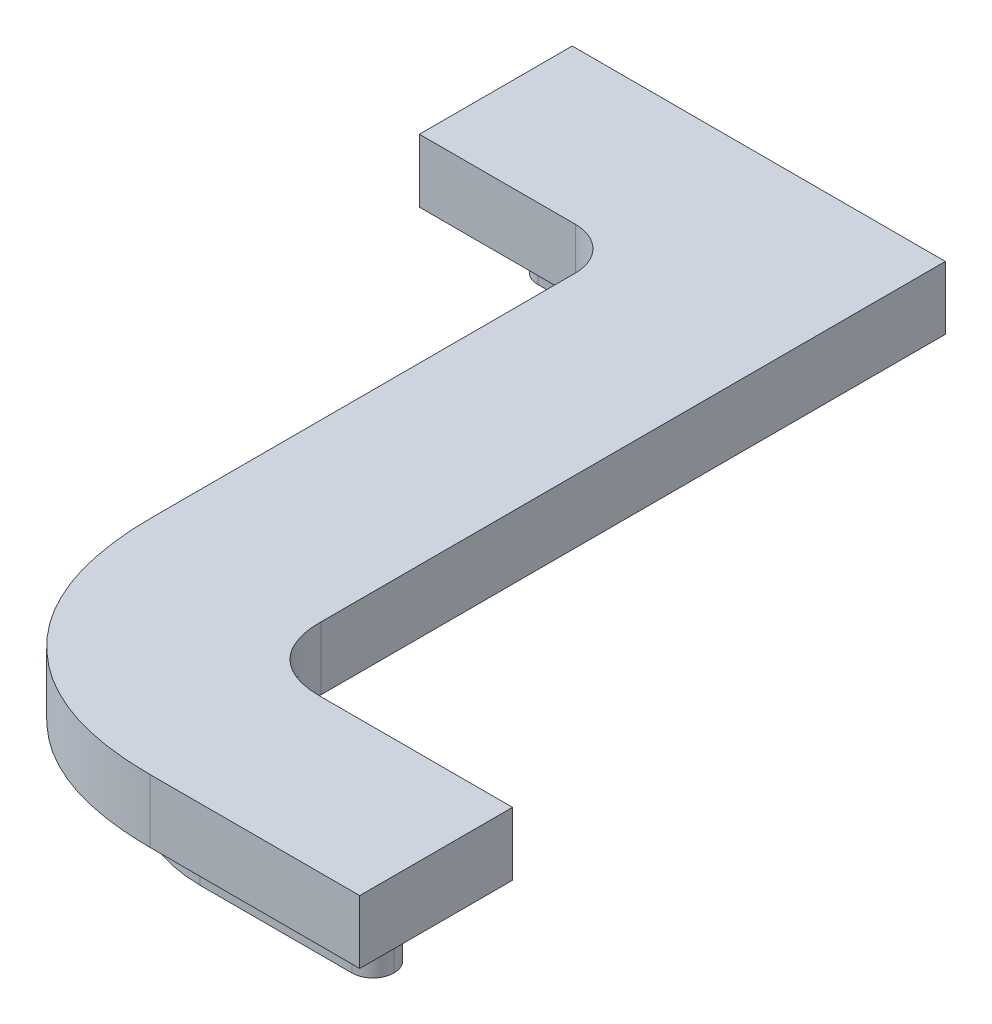
ISO-10303-21;
HEADER;
FILE_DESCRIPTION(('STEP AP214'),'2;1');
FILE_NAME('part.step','',(''),(''),'','','');
FILE_SCHEMA(('AUTOMOTIVE_DESIGN { 1 0 10303 214 1 1 1 1 }'));
ENDSEC;
DATA;
#1=APPLICATION_CONTEXT('core data for automotive mechanical design processes');
#2=APPLICATION_PROTOCOL_DEFINITION('international standard','automotive_design',2000,#1);
#3=PRODUCT_CONTEXT('',#1,'mechanical');
#4=PRODUCT('Part','Part','',(#3));
#5=PRODUCT_RELATED_PRODUCT_CATEGORY('part','',(#4));
#6=PRODUCT_DEFINITION_FORMATION('','',#4);
#7=PRODUCT_DEFINITION_CONTEXT('part definition',#1,'design');
#8=PRODUCT_DEFINITION('design','',#6,#7);
#9=PRODUCT_DEFINITION_SHAPE('','',#8);
#10=(LENGTH_UNIT() NAMED_UNIT(*) SI_UNIT(.MILLI.,.METRE.));
#11=(NAMED_UNIT(*) PLANE_ANGLE_UNIT() SI_UNIT($,.RADIAN.));
#12=(NAMED_UNIT(*) SI_UNIT($,.STERADIAN.) SOLID_ANGLE_UNIT());
#13=UNCERTAINTY_MEASURE_WITH_UNIT(LENGTH_MEASURE(1.E-05),#10,'distance_accuracy_value','');
#14=(GEOMETRIC_REPRESENTATION_CONTEXT(3) GLOBAL_UNCERTAINTY_ASSIGNED_CONTEXT((#13)) GLOBAL_UNIT_ASSIGNED_CONTEXT((#10,
#11,#12)) REPRESENTATION_CONTEXT('',''));
#15=CARTESIAN_POINT('',(0.,0.,0.));
#16=DIRECTION('',(0.,0.,1.));
#17=DIRECTION('',(1.,0.,0.));
#18=AXIS2_PLACEMENT_3D('',#15,#16,#17);
#19=CARTESIAN_POINT('',(37.0764102564102,15.,-163.701923076923));
#20=DIRECTION('',(0.,0.,-1.));
#21=DIRECTION('',(-1.,0.,0.));
#22=AXIS2_PLACEMENT_3D('',#19,#20,#21);
#23=PLANE('',#22);
#24=DIRECTION('',(1.,0.,0.));
#25=VECTOR('',#24,1.);
#26=CARTESIAN_POINT('',(37.0764102564102,0.,-163.701923076923));
#27=LINE('',#26,#25);
#28=CARTESIAN_POINT('',(0.,0.,-163.701923076923));
#29=VERTEX_POINT('',#28);
#30=CARTESIAN_POINT('',(37.0764102564102,0.,-163.701923076923));
#31=VERTEX_POINT('',#30);
#32=EDGE_CURVE('E278',#29,#31,#27,.T.);
#33=ORIENTED_EDGE('',*,*,#32,.T.);
#34=DIRECTION('',(0.,-1.,0.));
#35=VECTOR('',#34,1.);
#36=CARTESIAN_POINT('',(37.0764102564102,15.,-163.701923076923));
#37=LINE('',#36,#35);
#38=CARTESIAN_POINT('',(37.0764102564102,15.,-163.701923076923));
#39=VERTEX_POINT('',#38);
#40=EDGE_CURVE('E550',#39,#31,#37,.T.);
#41=ORIENTED_EDGE('',*,*,#40,.F.);
#42=DIRECTION('',(1.,0.,0.));
#43=VECTOR('',#42,1.);
#44=CARTESIAN_POINT('',(37.0764102564102,15.,-163.701923076923));
#45=LINE('',#44,#43);
#46=CARTESIAN_POINT('',(0.,15.,-163.701923076923));
#47=VERTEX_POINT('',#46);
#48=EDGE_CURVE('E293',#47,#39,#45,.T.);
#49=ORIENTED_EDGE('',*,*,#48,.F.);
#50=DIRECTION('',(0.,-1.,0.));
#51=VECTOR('',#50,1.);
#52=CARTESIAN_POINT('',(0.,15.,-163.701923076923));
#53=LINE('',#52,#51);
#54=EDGE_CURVE('E489',#47,#29,#53,.T.);
#55=ORIENTED_EDGE('',*,*,#54,.T.);
#56=EDGE_LOOP('',(#33,#41,#49,#55));
#57=FACE_BOUND('',#56,.T.);
#58=ADVANCED_FACE('F38',(#57),#23,.F.);
#59=CARTESIAN_POINT('',(37.0764102564103,15.,-153.701923076923));
#60=DIRECTION('',(0.,-1.,0.));
#61=DIRECTION('',(0.,0.,-1.));
#62=AXIS2_PLACEMENT_3D('',#59,#60,#61);
#63=CYLINDRICAL_SURFACE('',#62,10.);
#64=CARTESIAN_POINT('',(37.0764102564103,0.,-153.701923076923));
#65=DIRECTION('',(0.,-1.,0.));
#66=DIRECTION('',(0.,0.,1.));
#67=AXIS2_PLACEMENT_3D('',#64,#65,#66);
#68=CIRCLE('',#67,10.);
#69=CARTESIAN_POINT('',(47.0764102564103,0.,-153.701923076923));
#70=VERTEX_POINT('',#69);
#71=EDGE_CURVE('E492',#31,#70,#68,.T.);
#72=ORIENTED_EDGE('',*,*,#71,.T.);
#73=DIRECTION('',(0.,-1.,0.));
#74=VECTOR('',#73,1.);
#75=CARTESIAN_POINT('',(47.0764102564103,15.,-153.701923076923));
#76=LINE('',#75,#74);
#77=CARTESIAN_POINT('',(47.0764102564103,15.,-153.701923076923));
#78=VERTEX_POINT('',#77);
#79=EDGE_CURVE('E547',#78,#70,#76,.T.);
#80=ORIENTED_EDGE('',*,*,#79,.F.);
#81=CARTESIAN_POINT('',(37.0764102564103,15.,-153.701923076923));
#82=DIRECTION('',(0.,-1.,0.));
#83=DIRECTION('',(0.,0.,1.));
#84=AXIS2_PLACEMENT_3D('',#81,#82,#83);
#85=CIRCLE('',#84,10.);
#86=EDGE_CURVE('E296',#39,#78,#85,.T.);
#87=ORIENTED_EDGE('',*,*,#86,.F.);
#88=ORIENTED_EDGE('',*,*,#40,.T.);
#89=EDGE_LOOP('',(#72,#80,#87,#88));
#90=FACE_BOUND('',#89,.T.);
#91=ADVANCED_FACE('F322',(#90),#63,.F.);
#92=CARTESIAN_POINT('',(47.0764102564103,15.,-53.1650641025641));
#93=DIRECTION('',(1.,0.,0.));
#94=DIRECTION('',(0.,0.,-1.));
#95=AXIS2_PLACEMENT_3D('',#92,#93,#94);
#96=PLANE('',#95);
#97=DIRECTION('',(0.,0.,1.));
#98=VECTOR('',#97,1.);
#99=CARTESIAN_POINT('',(47.0764102564103,0.,-53.1650641025641));
#100=LINE('',#99,#98);
#101=CARTESIAN_POINT('',(47.0764102564103,0.,-53.1650641025641));
#102=VERTEX_POINT('',#101);
#103=EDGE_CURVE('E494',#70,#102,#100,.T.);
#104=ORIENTED_EDGE('',*,*,#103,.T.);
#105=DIRECTION('',(0.,-1.,0.));
#106=VECTOR('',#105,1.);
#107=CARTESIAN_POINT('',(47.0764102564103,15.,-53.1650641025641));
#108=LINE('',#107,#106);
#109=CARTESIAN_POINT('',(47.0764102564103,15.,-53.1650641025641));
#110=VERTEX_POINT('',#109);
#111=EDGE_CURVE('E544',#110,#102,#108,.T.);
#112=ORIENTED_EDGE('',*,*,#111,.F.);
#113=DIRECTION('',(0.,0.,1.));
#114=VECTOR('',#113,1.);
#115=CARTESIAN_POINT('',(47.0764102564103,15.,-53.1650641025641));
#116=LINE('',#115,#114);
#117=EDGE_CURVE('E299',#78,#110,#116,.T.);
#118=ORIENTED_EDGE('',*,*,#117,.F.);
#119=ORIENTED_EDGE('',*,*,#79,.T.);
#120=EDGE_LOOP('',(#104,#112,#118,#119));
#121=FACE_BOUND('',#120,.T.);
#122=ADVANCED_FACE('F317',(#121),#96,.F.);
#123=CARTESIAN_POINT('',(47.0764102564103,15.,-53.1650641025641));
#124=CARTESIAN_POINT('',(47.0223914539136,15.,-49.2205914346598));
#125=CARTESIAN_POINT('',(47.490582866725,15.,-43.4418682344713));
#126=CARTESIAN_POINT('',(48.9340020285453,15.,-36.0357843236271));
#127=CARTESIAN_POINT('',(50.4537891082744,15.,-30.9580072773758));
#128=CARTESIAN_POINT('',(52.441129709461,15.,-26.2248686930387));
#129=CARTESIAN_POINT('',(54.8335542346932,15.,-21.8052640760056));
#130=CARTESIAN_POINT('',(57.6963001509259,15.,-17.7306783300494));
#131=CARTESIAN_POINT('',(60.9888602548678,15.,-14.0464264073738));
#132=CARTESIAN_POINT('',(64.6570791168126,15.,-10.7440013801647));
#133=CARTESIAN_POINT('',(68.659607959632,15.,-7.84267512579838));
#134=CARTESIAN_POINT('',(73.0474211778718,15.,-5.43577363491742));
#135=CARTESIAN_POINT('',(77.7224103867646,15.,-3.42066978882483));
#136=CARTESIAN_POINT('',(82.7564497572889,15.,-1.91342324769866));
#137=CARTESIAN_POINT('',(90.049186966096,15.,-0.354248464101049));
#138=CARTESIAN_POINT('',(95.787985552182,15.,-0.0565611925962197));
#139=CARTESIAN_POINT('',(99.6805769230769,15.,0.));
#140=B_SPLINE_CURVE_WITH_KNOTS('',3,(#123,#124,#125,#126,#127,#128,#129,#130,#131,#132,#133,
#134,#135,#136,#137,#138,#139),.UNSPECIFIED.,.F.,.F.,(4,1,1,1,1,1,1,1,1,1,1,1,1,1,4),(0.,
0.139367673018385,0.204389389727037,0.266545229328978,0.326453394085407,0.385631058355293,
0.443939169385015,0.502143900552233,0.559996915054743,0.618193981149015,0.676544157389738,
0.736636343687914,0.79788844457623,0.862079824017859,1.),.UNSPECIFIED.);
#141=DIRECTION('',(0.,-1.,0.));
#142=VECTOR('',#141,1.);
#143=SURFACE_OF_LINEAR_EXTRUSION('',#140,#142);
#144=CARTESIAN_POINT('',(47.0764102564103,0.,-53.1650641025641));
#145=CARTESIAN_POINT('',(47.0223914539136,0.,-49.2205914346598));
#146=CARTESIAN_POINT('',(47.490582866725,0.,-43.4418682344713));
#147=CARTESIAN_POINT('',(48.9340020285453,0.,-36.0357843236271));
#148=CARTESIAN_POINT('',(50.4537891082744,0.,-30.9580072773758));
#149=CARTESIAN_POINT('',(52.441129709461,0.,-26.2248686930387));
#150=CARTESIAN_POINT('',(54.8335542346932,0.,-21.8052640760056));
#151=CARTESIAN_POINT('',(57.6963001509259,0.,-17.7306783300494));
#152=CARTESIAN_POINT('',(60.9888602548678,0.,-14.0464264073738));
#153=CARTESIAN_POINT('',(64.6570791168126,0.,-10.7440013801647));
#154=CARTESIAN_POINT('',(68.659607959632,0.,-7.84267512579838));
#155=CARTESIAN_POINT('',(73.0474211778718,0.,-5.43577363491742));
#156=CARTESIAN_POINT('',(77.7224103867646,0.,-3.42066978882483));
#157=CARTESIAN_POINT('',(82.7564497572889,0.,-1.91342324769866));
#158=CARTESIAN_POINT('',(90.049186966096,0.,-0.354248464101049));
#159=CARTESIAN_POINT('',(95.787985552182,0.,-0.0565611925962197));
#160=CARTESIAN_POINT('',(99.6805769230769,0.,0.));
#161=B_SPLINE_CURVE_WITH_KNOTS('',3,(#144,#145,#146,#147,#148,#149,#150,#151,#152,#153,#154,
#155,#156,#157,#158,#159,#160),.UNSPECIFIED.,.F.,.F.,(4,1,1,1,1,1,1,1,1,1,1,1,1,1,4),(0.,
0.139367673018385,0.204389389727037,0.266545229328978,0.326453394085407,0.385631058355293,
0.443939169385015,0.502143900552233,0.559996915054743,0.618193981149015,0.676544157389738,
0.736636343687914,0.79788844457623,0.862079824017859,1.),.UNSPECIFIED.);
#162=CARTESIAN_POINT('',(99.6805769230769,0.,0.));
#163=VERTEX_POINT('',#162);
#164=EDGE_CURVE('E496',#102,#163,#161,.T.);
#165=ORIENTED_EDGE('',*,*,#164,.T.);
#166=DIRECTION('',(0.,-1.,0.));
#167=VECTOR('',#166,1.);
#168=CARTESIAN_POINT('',(99.6805769230769,15.,0.));
#169=LINE('',#168,#167);
#170=CARTESIAN_POINT('',(99.6805769230769,15.,0.));
#171=VERTEX_POINT('',#170);
#172=EDGE_CURVE('E541',#171,#163,#169,.T.);
#173=ORIENTED_EDGE('',*,*,#172,.F.);
#174=EDGE_CURVE('E301',#110,#171,#140,.T.);
#175=ORIENTED_EDGE('',*,*,#174,.F.);
#176=ORIENTED_EDGE('',*,*,#111,.T.);
#177=EDGE_LOOP('',(#165,#173,#175,#176));
#178=FACE_BOUND('',#177,.T.);
#179=ADVANCED_FACE('F312',(#178),#143,.F.);
#180=CARTESIAN_POINT('',(149.520320512821,15.,0.));
#181=DIRECTION('',(0.,0.,-1.));
#182=DIRECTION('',(-1.,0.,0.));
#183=AXIS2_PLACEMENT_3D('',#180,#181,#182);
#184=PLANE('',#183);
#185=DIRECTION('',(1.,0.,0.));
#186=VECTOR('',#185,1.);
#187=CARTESIAN_POINT('',(149.520320512821,0.,0.));
#188=LINE('',#187,#186);
#189=CARTESIAN_POINT('',(149.520320512821,0.,0.));
#190=VERTEX_POINT('',#189);
#191=EDGE_CURVE('E500',#163,#190,#188,.T.);
#192=ORIENTED_EDGE('',*,*,#191,.T.);
#193=DIRECTION('',(0.,-1.,0.));
#194=VECTOR('',#193,1.);
#195=CARTESIAN_POINT('',(149.520320512821,15.,0.));
#196=LINE('',#195,#194);
#197=CARTESIAN_POINT('',(149.520320512821,15.,0.));
#198=VERTEX_POINT('',#197);
#199=EDGE_CURVE('E538',#198,#190,#196,.T.);
#200=ORIENTED_EDGE('',*,*,#199,.F.);
#201=DIRECTION('',(1.,0.,0.));
#202=VECTOR('',#201,1.);
#203=CARTESIAN_POINT('',(149.520320512821,15.,0.));
#204=LINE('',#203,#202);
#205=EDGE_CURVE('E306',#171,#198,#204,.T.);
#206=ORIENTED_EDGE('',*,*,#205,.F.);
#207=ORIENTED_EDGE('',*,*,#172,.T.);
#208=EDGE_LOOP('',(#192,#200,#206,#207));
#209=FACE_BOUND('',#208,.T.);
#210=ADVANCED_FACE('F316',(#209),#184,.F.);
#211=CARTESIAN_POINT('',(149.520320512821,15.,-36.2980769230769));
#212=DIRECTION('',(-1.,0.,0.));
#213=DIRECTION('',(0.,0.,1.));
#214=AXIS2_PLACEMENT_3D('',#211,#212,#213);
#215=PLANE('',#214);
#216=DIRECTION('',(0.,0.,-1.));
#217=VECTOR('',#216,1.);
#218=CARTESIAN_POINT('',(149.520320512821,0.,-36.2980769230769));
#219=LINE('',#218,#217);
#220=CARTESIAN_POINT('',(149.520320512821,0.,-36.2980769230769));
#221=VERTEX_POINT('',#220);
#222=EDGE_CURVE('E505',#190,#221,#219,.T.);
#223=ORIENTED_EDGE('',*,*,#222,.T.);
#224=DIRECTION('',(0.,-1.,0.));
#225=VECTOR('',#224,1.);
#226=CARTESIAN_POINT('',(149.520320512821,15.,-36.2980769230769));
#227=LINE('',#226,#225);
#228=CARTESIAN_POINT('',(149.520320512821,15.,-36.2980769230769));
#229=VERTEX_POINT('',#228);
#230=EDGE_CURVE('E535',#229,#221,#227,.T.);
#231=ORIENTED_EDGE('',*,*,#230,.F.);
#232=DIRECTION('',(0.,0.,-1.));
#233=VECTOR('',#232,1.);
#234=CARTESIAN_POINT('',(149.520320512821,15.,-36.2980769230769));
#235=LINE('',#234,#233);
#236=EDGE_CURVE('E605',#198,#229,#235,.T.);
#237=ORIENTED_EDGE('',*,*,#236,.F.);
#238=ORIENTED_EDGE('',*,*,#199,.T.);
#239=EDGE_LOOP('',(#223,#231,#237,#238));
#240=FACE_BOUND('',#239,.T.);
#241=ADVANCED_FACE('F603',(#240),#215,.F.);
#242=CARTESIAN_POINT('',(103.847243589744,15.,-36.2980769230769));
#243=DIRECTION('',(0.,0.,1.));
#244=DIRECTION('',(1.,0.,0.));
#245=AXIS2_PLACEMENT_3D('',#242,#243,#244);
#246=PLANE('',#245);
#247=DIRECTION('',(-1.,0.,0.));
#248=VECTOR('',#247,1.);
#249=CARTESIAN_POINT('',(103.847243589744,0.,-36.2980769230769));
#250=LINE('',#249,#248);
#251=CARTESIAN_POINT('',(103.847243589744,0.,-36.2980769230769));
#252=VERTEX_POINT('',#251);
#253=EDGE_CURVE('E507',#221,#252,#250,.T.);
#254=ORIENTED_EDGE('',*,*,#253,.T.);
#255=DIRECTION('',(0.,-1.,0.));
#256=VECTOR('',#255,1.);
#257=CARTESIAN_POINT('',(103.847243589744,15.,-36.2980769230769));
#258=LINE('',#257,#256);
#259=CARTESIAN_POINT('',(103.847243589744,15.,-36.2980769230769));
#260=VERTEX_POINT('',#259);
#261=EDGE_CURVE('E532',#260,#252,#258,.T.);
#262=ORIENTED_EDGE('',*,*,#261,.F.);
#263=DIRECTION('',(-1.,0.,0.));
#264=VECTOR('',#263,1.);
#265=CARTESIAN_POINT('',(103.847243589744,15.,-36.2980769230769));
#266=LINE('',#265,#264);
#267=EDGE_CURVE('E480',#229,#260,#266,.T.);
#268=ORIENTED_EDGE('',*,*,#267,.F.);
#269=ORIENTED_EDGE('',*,*,#230,.T.);
#270=EDGE_LOOP('',(#254,#262,#268,#269));
#271=FACE_BOUND('',#270,.T.);
#272=ADVANCED_FACE('F471',(#271),#246,.F.);
#273=CARTESIAN_POINT('',(103.847243589744,15.,-36.2980769230769));
#274=CARTESIAN_POINT('',(101.687793553922,15.,-36.2886461989768));
#275=CARTESIAN_POINT('',(98.4929336917402,15.,-36.6691906997311));
#276=CARTESIAN_POINT('',(94.8002932546507,15.,-38.4798858647078));
#277=CARTESIAN_POINT('',(92.5436805057884,15.,-40.2729447282628));
#278=CARTESIAN_POINT('',(90.7560665444635,15.,-42.5488365957673));
#279=CARTESIAN_POINT('',(89.0340953603292,15.,-46.3140425211422));
#280=CARTESIAN_POINT('',(88.5843241362368,15.,-49.498745128976));
#281=CARTESIAN_POINT('',(88.6228846153846,15.,-51.6826923076923));
#282=B_SPLINE_CURVE_WITH_KNOTS('',3,(#273,#274,#275,#276,#277,#278,#279,#280,#281),
.UNSPECIFIED.,.F.,.F.,(4,1,1,1,1,1,4),(0.,0.265143967513863,0.383298646538262,0.498166168431169,
0.614311634426918,0.733229188654396,1.),.UNSPECIFIED.);
#283=DIRECTION('',(0.,-1.,0.));
#284=VECTOR('',#283,1.);
#285=SURFACE_OF_LINEAR_EXTRUSION('',#282,#284);
#286=CARTESIAN_POINT('',(103.847243589744,0.,-36.2980769230769));
#287=CARTESIAN_POINT('',(101.687793553922,0.,-36.2886461989768));
#288=CARTESIAN_POINT('',(98.4929336917402,0.,-36.6691906997311));
#289=CARTESIAN_POINT('',(94.8002932546507,0.,-38.4798858647078));
#290=CARTESIAN_POINT('',(92.5436805057884,0.,-40.2729447282628));
#291=CARTESIAN_POINT('',(90.7560665444635,0.,-42.5488365957673));
#292=CARTESIAN_POINT('',(89.0340953603292,0.,-46.3140425211422));
#293=CARTESIAN_POINT('',(88.5843241362368,0.,-49.498745128976));
#294=CARTESIAN_POINT('',(88.6228846153846,0.,-51.6826923076923));
#295=B_SPLINE_CURVE_WITH_KNOTS('',3,(#286,#287,#288,#289,#290,#291,#292,#293,#294),
.UNSPECIFIED.,.F.,.F.,(4,1,1,1,1,1,4),(0.,0.265143967513863,0.383298646538262,0.498166168431169,
0.614311634426918,0.733229188654396,1.),.UNSPECIFIED.);
#296=CARTESIAN_POINT('',(88.6228846153846,0.,-51.6826923076923));
#297=VERTEX_POINT('',#296);
#298=EDGE_CURVE('E509',#252,#297,#295,.T.);
#299=ORIENTED_EDGE('',*,*,#298,.T.);
#300=DIRECTION('',(0.,-1.,0.));
#301=VECTOR('',#300,1.);
#302=CARTESIAN_POINT('',(88.6228846153846,15.,-51.6826923076923));
#303=LINE('',#302,#301);
#304=CARTESIAN_POINT('',(88.6228846153846,15.,-51.6826923076923));
#305=VERTEX_POINT('',#304);
#306=EDGE_CURVE('E529',#305,#297,#303,.T.);
#307=ORIENTED_EDGE('',*,*,#306,.F.);
#308=EDGE_CURVE('E473',#260,#305,#282,.T.);
#309=ORIENTED_EDGE('',*,*,#308,.F.);
#310=ORIENTED_EDGE('',*,*,#261,.T.);
#311=EDGE_LOOP('',(#299,#307,#309,#310));
#312=FACE_BOUND('',#311,.T.);
#313=ADVANCED_FACE('F466',(#312),#285,.F.);
#314=CARTESIAN_POINT('',(88.6228846153846,15.,-200.));
#315=DIRECTION('',(-1.,0.,0.));
#316=DIRECTION('',(0.,0.,1.));
#317=AXIS2_PLACEMENT_3D('',#314,#315,#316);
#318=PLANE('',#317);
#319=DIRECTION('',(0.,0.,-1.));
#320=VECTOR('',#319,1.);
#321=CARTESIAN_POINT('',(88.6228846153846,0.,-200.));
#322=LINE('',#321,#320);
#323=CARTESIAN_POINT('',(88.6228846153846,0.,-200.));
#324=VERTEX_POINT('',#323);
#325=EDGE_CURVE('E513',#297,#324,#322,.T.);
#326=ORIENTED_EDGE('',*,*,#325,.T.);
#327=DIRECTION('',(0.,-1.,0.));
#328=VECTOR('',#327,1.);
#329=CARTESIAN_POINT('',(88.6228846153846,15.,-200.));
#330=LINE('',#329,#328);
#331=CARTESIAN_POINT('',(88.6228846153846,15.,-200.));
#332=VERTEX_POINT('',#331);
#333=EDGE_CURVE('E526',#332,#324,#330,.T.);
#334=ORIENTED_EDGE('',*,*,#333,.F.);
#335=DIRECTION('',(0.,0.,-1.));
#336=VECTOR('',#335,1.);
#337=CARTESIAN_POINT('',(88.6228846153846,15.,-200.));
#338=LINE('',#337,#336);
#339=EDGE_CURVE('E479',#305,#332,#338,.T.);
#340=ORIENTED_EDGE('',*,*,#339,.F.);
#341=ORIENTED_EDGE('',*,*,#306,.T.);
#342=EDGE_LOOP('',(#326,#334,#340,#341));
#343=FACE_BOUND('',#342,.T.);
#344=ADVANCED_FACE('F462',(#343),#318,.F.);
#345=CARTESIAN_POINT('',(0.,15.,-200.));
#346=DIRECTION('',(0.,0.,1.));
#347=DIRECTION('',(1.,0.,0.));
#348=AXIS2_PLACEMENT_3D('',#345,#346,#347);
#349=PLANE('',#348);
#350=DIRECTION('',(-1.,0.,0.));
#351=VECTOR('',#350,1.);
#352=CARTESIAN_POINT('',(0.,0.,-200.));
#353=LINE('',#352,#351);
#354=CARTESIAN_POINT('',(0.,0.,-200.));
#355=VERTEX_POINT('',#354);
#356=EDGE_CURVE('E518',#324,#355,#353,.T.);
#357=ORIENTED_EDGE('',*,*,#356,.T.);
#358=DIRECTION('',(0.,-1.,0.));
#359=VECTOR('',#358,1.);
#360=CARTESIAN_POINT('',(0.,15.,-200.));
#361=LINE('',#360,#359);
#362=CARTESIAN_POINT('',(0.,15.,-200.));
#363=VERTEX_POINT('',#362);
#364=EDGE_CURVE('E523',#363,#355,#361,.T.);
#365=ORIENTED_EDGE('',*,*,#364,.F.);
#366=DIRECTION('',(-1.,0.,0.));
#367=VECTOR('',#366,1.);
#368=CARTESIAN_POINT('',(0.,15.,-200.));
#369=LINE('',#368,#367);
#370=EDGE_CURVE('E485',#332,#363,#369,.T.);
#371=ORIENTED_EDGE('',*,*,#370,.F.);
#372=ORIENTED_EDGE('',*,*,#333,.T.);
#373=EDGE_LOOP('',(#357,#365,#371,#372));
#374=FACE_BOUND('',#373,.T.);
#375=ADVANCED_FACE('F458',(#374),#349,.F.);
#376=CARTESIAN_POINT('',(0.,15.,-163.701923076923));
#377=DIRECTION('',(1.,0.,0.));
#378=DIRECTION('',(0.,0.,-1.));
#379=AXIS2_PLACEMENT_3D('',#376,#377,#378);
#380=PLANE('',#379);
#381=DIRECTION('',(0.,0.,1.));
#382=VECTOR('',#381,1.);
#383=CARTESIAN_POINT('',(0.,0.,-163.701923076923));
#384=LINE('',#383,#382);
#385=EDGE_CURVE('E297',#355,#29,#384,.T.);
#386=ORIENTED_EDGE('',*,*,#385,.T.);
#387=ORIENTED_EDGE('',*,*,#54,.F.);
#388=DIRECTION('',(0.,0.,1.));
#389=VECTOR('',#388,1.);
#390=CARTESIAN_POINT('',(0.,15.,-163.701923076923));
#391=LINE('',#390,#389);
#392=EDGE_CURVE('E487',#363,#47,#391,.T.);
#393=ORIENTED_EDGE('',*,*,#392,.F.);
#394=ORIENTED_EDGE('',*,*,#364,.T.);
#395=EDGE_LOOP('',(#386,#387,#393,#394));
#396=FACE_BOUND('',#395,.T.);
#397=ADVANCED_FACE('F452',(#396),#380,.F.);
#398=CARTESIAN_POINT('',(92.5975037094946,15.,-40.3766062952427));
#399=DIRECTION('',(0.,-1.,0.));
#400=DIRECTION('',(0.,0.,-1.));
#401=AXIS2_PLACEMENT_3D('',#398,#399,#400);
#402=PLANE('',#401);
#403=ORIENTED_EDGE('',*,*,#48,.T.);
#404=ORIENTED_EDGE('',*,*,#86,.T.);
#405=ORIENTED_EDGE('',*,*,#117,.T.);
#406=ORIENTED_EDGE('',*,*,#174,.T.);
#407=ORIENTED_EDGE('',*,*,#205,.T.);
#408=ORIENTED_EDGE('',*,*,#236,.T.);
#409=ORIENTED_EDGE('',*,*,#267,.T.);
#410=ORIENTED_EDGE('',*,*,#308,.T.);
#411=ORIENTED_EDGE('',*,*,#339,.T.);
#412=ORIENTED_EDGE('',*,*,#370,.T.);
#413=ORIENTED_EDGE('',*,*,#392,.T.);
#414=EDGE_LOOP('',(#403,#404,#405,#406,#407,#408,#409,#410,#411,#412,#413));
#415=FACE_BOUND('',#414,.T.);
#416=ADVANCED_FACE('F449',(#415),#402,.F.);
#417=CARTESIAN_POINT('',(92.5975037094946,0.,-40.3766062952427));
#418=DIRECTION('',(0.,-1.,0.));
#419=DIRECTION('',(0.,0.,-1.));
#420=AXIS2_PLACEMENT_3D('',#417,#418,#419);
#421=PLANE('',#420);
#422=CARTESIAN_POINT('',(98.746280115898,0.,-49.0403935729775));
#423=DIRECTION('',(0.,1.,0.));
#424=DIRECTION('',(1.,0.,0.));
#425=AXIS2_PLACEMENT_3D('',#422,#423,#424);
#426=CIRCLE('',#425,35.893043115898);
#427=CARTESIAN_POINT('',(62.853237,0.,-49.0403935729775));
#428=VERTEX_POINT('',#427);
#429=CARTESIAN_POINT('',(98.3981779108453,0.,-13.1490385));
#430=VERTEX_POINT('',#429);
#431=EDGE_CURVE('E234',#428,#430,#426,.T.);
#432=ORIENTED_EDGE('',*,*,#431,.T.);
#433=DIRECTION('',(1.,0.,0.));
#434=VECTOR('',#433,1.);
#435=CARTESIAN_POINT('',(98.4233331915312,0.,-13.1490385));
#436=LINE('',#435,#434);
#437=CARTESIAN_POINT('',(134.520321,0.,-13.1490385));
#438=VERTEX_POINT('',#437);
#439=EDGE_CURVE('E253',#430,#438,#436,.T.);
#440=ORIENTED_EDGE('',*,*,#439,.T.);
#441=CARTESIAN_POINT('',(134.520321,0.,-18.1490385));
#442=DIRECTION('',(0.,-1.,0.));
#443=DIRECTION('',(0.,0.,-1.));
#444=AXIS2_PLACEMENT_3D('',#441,#442,#443);
#445=CIRCLE('',#444,5.);
#446=CARTESIAN_POINT('',(139.520321,0.,-18.1490385));
#447=VERTEX_POINT('',#446);
#448=EDGE_CURVE('E60',#438,#447,#445,.F.);
#449=ORIENTED_EDGE('',*,*,#448,.T.);
#450=CARTESIAN_POINT('',(134.520321,0.,-18.1490385));
#451=DIRECTION('',(0.,-1.,0.));
#452=DIRECTION('',(0.,0.,-1.));
#453=AXIS2_PLACEMENT_3D('',#450,#451,#452);
#454=CIRCLE('',#453,5.);
#455=CARTESIAN_POINT('',(134.520321,0.,-23.1490385));
#456=VERTEX_POINT('',#455);
#457=EDGE_CURVE('E375',#447,#456,#454,.F.);
#458=ORIENTED_EDGE('',*,*,#457,.T.);
#459=DIRECTION('',(1.,0.,0.));
#460=VECTOR('',#459,1.);
#461=CARTESIAN_POINT('',(98.4233331915312,0.,-23.1490385));
#462=LINE('',#461,#460);
#463=CARTESIAN_POINT('',(98.4506210440715,0.,-23.1490385));
#464=VERTEX_POINT('',#463);
#465=EDGE_CURVE('E255',#464,#456,#462,.T.);
#466=ORIENTED_EDGE('',*,*,#465,.F.);
#467=CARTESIAN_POINT('',(98.746280115898,0.,-49.0403935729775));
#468=DIRECTION('',(0.,1.,0.));
#469=DIRECTION('',(1.,0.,0.));
#470=AXIS2_PLACEMENT_3D('',#467,#468,#469);
#471=CIRCLE('',#470,25.893043115898);
#472=CARTESIAN_POINT('',(72.853237,0.,-49.0403935729775));
#473=VERTEX_POINT('',#472);
#474=EDGE_CURVE('E221',#473,#464,#471,.T.);
#475=ORIENTED_EDGE('',*,*,#474,.F.);
#476=DIRECTION('',(0.,0.,-1.));
#477=VECTOR('',#476,1.);
#478=CARTESIAN_POINT('',(72.853237,0.,-166.8490385));
#479=LINE('',#478,#477);
#480=CARTESIAN_POINT('',(72.853237,0.,-166.8490385));
#481=VERTEX_POINT('',#480);
#482=EDGE_CURVE('E259',#481,#473,#479,.F.);
#483=ORIENTED_EDGE('',*,*,#482,.F.);
#484=CARTESIAN_POINT('',(52.853237,0.,-166.8490385));
#485=DIRECTION('',(0.,1.,0.));
#486=DIRECTION('',(1.,0.,0.));
#487=AXIS2_PLACEMENT_3D('',#484,#485,#486);
#488=CIRCLE('',#487,20.);
#489=CARTESIAN_POINT('',(52.853237,0.,-186.8490385));
#490=VERTEX_POINT('',#489);
#491=EDGE_CURVE('E261',#490,#481,#488,.F.);
#492=ORIENTED_EDGE('',*,*,#491,.F.);
#493=DIRECTION('',(1.,0.,0.));
#494=VECTOR('',#493,1.);
#495=CARTESIAN_POINT('',(9.99999999999998,0.,-186.8490385));
#496=LINE('',#495,#494);
#497=CARTESIAN_POINT('',(15.,0.,-186.8490385));
#498=VERTEX_POINT('',#497);
#499=EDGE_CURVE('E263',#498,#490,#496,.T.);
#500=ORIENTED_EDGE('',*,*,#499,.F.);
#501=CARTESIAN_POINT('',(15.,0.,-181.8490385));
#502=DIRECTION('',(0.,-1.,0.));
#503=DIRECTION('',(0.,0.,-1.));
#504=AXIS2_PLACEMENT_3D('',#501,#502,#503);
#505=CIRCLE('',#504,5.);
#506=CARTESIAN_POINT('',(9.99999999999998,0.,-181.8490385));
#507=VERTEX_POINT('',#506);
#508=EDGE_CURVE('E11',#498,#507,#505,.F.);
#509=ORIENTED_EDGE('',*,*,#508,.T.);
#510=CARTESIAN_POINT('',(15.,0.,-181.8490385));
#511=DIRECTION('',(0.,-1.,0.));
#512=DIRECTION('',(0.,0.,-1.));
#513=AXIS2_PLACEMENT_3D('',#510,#511,#512);
#514=CIRCLE('',#513,5.);
#515=CARTESIAN_POINT('',(15.,0.,-176.8490385));
#516=VERTEX_POINT('',#515);
#517=EDGE_CURVE('E47',#507,#516,#514,.F.);
#518=ORIENTED_EDGE('',*,*,#517,.T.);
#519=DIRECTION('',(1.,0.,0.));
#520=VECTOR('',#519,1.);
#521=CARTESIAN_POINT('',(9.99999999999998,0.,-176.8490385));
#522=LINE('',#521,#520);
#523=CARTESIAN_POINT('',(52.853237,0.,-176.8490385));
#524=VERTEX_POINT('',#523);
#525=EDGE_CURVE('E265',#516,#524,#522,.T.);
#526=ORIENTED_EDGE('',*,*,#525,.T.);
#527=CARTESIAN_POINT('',(52.853237,0.,-166.8490385));
#528=DIRECTION('',(0.,1.,0.));
#529=DIRECTION('',(1.,0.,0.));
#530=AXIS2_PLACEMENT_3D('',#527,#528,#529);
#531=CIRCLE('',#530,9.99999999999999);
#532=CARTESIAN_POINT('',(62.853237,0.,-166.8490385));
#533=VERTEX_POINT('',#532);
#534=EDGE_CURVE('E267',#524,#533,#531,.F.);
#535=ORIENTED_EDGE('',*,*,#534,.T.);
#536=DIRECTION('',(0.,0.,-1.));
#537=VECTOR('',#536,1.);
#538=CARTESIAN_POINT('',(62.853237,0.,-166.8490385));
#539=LINE('',#538,#537);
#540=EDGE_CURVE('E270',#533,#428,#539,.F.);
#541=ORIENTED_EDGE('',*,*,#540,.T.);
#542=EDGE_LOOP('',(#432,#440,#449,#458,#466,#475,#483,#492,#500,#509,#518,#526,#535,#541));
#543=FACE_BOUND('',#542,.T.);
#544=ORIENTED_EDGE('',*,*,#32,.F.);
#545=ORIENTED_EDGE('',*,*,#385,.F.);
#546=ORIENTED_EDGE('',*,*,#356,.F.);
#547=ORIENTED_EDGE('',*,*,#325,.F.);
#548=ORIENTED_EDGE('',*,*,#298,.F.);
#549=ORIENTED_EDGE('',*,*,#253,.F.);
#550=ORIENTED_EDGE('',*,*,#222,.F.);
#551=ORIENTED_EDGE('',*,*,#191,.F.);
#552=ORIENTED_EDGE('',*,*,#164,.F.);
#553=ORIENTED_EDGE('',*,*,#103,.F.);
#554=ORIENTED_EDGE('',*,*,#71,.F.);
#555=EDGE_LOOP('',(#544,#545,#546,#547,#548,#549,#550,#551,#552,#553,#554));
#556=FACE_BOUND('',#555,.T.);
#557=ADVANCED_FACE('F373',(#543,#556),#421,.T.);
#558=CARTESIAN_POINT('',(98.4233331915312,-15.,-13.1490385));
#559=DIRECTION('',(0.,0.,1.));
#560=DIRECTION('',(1.,0.,0.));
#561=AXIS2_PLACEMENT_3D('',#558,#559,#560);
#562=PLANE('',#561);
#563=DIRECTION('',(1.,0.,0.));
#564=VECTOR('',#563,1.);
#565=CARTESIAN_POINT('',(98.4233331915312,-15.,-13.1490385));
#566=LINE('',#565,#564);
#567=CARTESIAN_POINT('',(98.3981779108453,-15.,-13.1490385));
#568=VERTEX_POINT('',#567);
#569=CARTESIAN_POINT('',(134.520321,-15.,-13.1490385));
#570=VERTEX_POINT('',#569);
#571=EDGE_CURVE('E231',#568,#570,#566,.T.);
#572=ORIENTED_EDGE('',*,*,#571,.T.);
#573=DIRECTION('',(0.,1.,0.));
#574=VECTOR('',#573,1.);
#575=CARTESIAN_POINT('',(134.520321,0.,-13.1490385));
#576=LINE('',#575,#574);
#577=EDGE_CURVE('E553',#570,#438,#576,.T.);
#578=ORIENTED_EDGE('',*,*,#577,.T.);
#579=ORIENTED_EDGE('',*,*,#439,.F.);
#580=DIRECTION('',(0.,1.,0.));
#581=VECTOR('',#580,1.);
#582=CARTESIAN_POINT('',(98.3981779108453,-15.,-13.1490385));
#583=LINE('',#582,#581);
#584=EDGE_CURVE('E275',#568,#430,#583,.T.);
#585=ORIENTED_EDGE('',*,*,#584,.F.);
#586=EDGE_LOOP('',(#572,#578,#579,#585));
#587=FACE_BOUND('',#586,.T.);
#588=ADVANCED_FACE('F421',(#587),#562,.T.);
#589=CARTESIAN_POINT('',(98.746280115898,-15.,-49.0403935729775));
#590=DIRECTION('',(0.,1.,0.));
#591=DIRECTION('',(0.,0.,1.));
#592=AXIS2_PLACEMENT_3D('',#589,#590,#591);
#593=CYLINDRICAL_SURFACE('',#592,35.893043115898);
#594=ORIENTED_EDGE('',*,*,#431,.F.);
#595=DIRECTION('',(0.,1.,0.));
#596=VECTOR('',#595,1.);
#597=CARTESIAN_POINT('',(62.853237,-15.,-49.0403935729775));
#598=LINE('',#597,#596);
#599=CARTESIAN_POINT('',(62.853237,-15.,-49.0403935729775));
#600=VERTEX_POINT('',#599);
#601=EDGE_CURVE('E279',#600,#428,#598,.T.);
#602=ORIENTED_EDGE('',*,*,#601,.F.);
#603=CARTESIAN_POINT('',(98.746280115898,-15.,-49.0403935729775));
#604=DIRECTION('',(0.,1.,0.));
#605=DIRECTION('',(1.,0.,0.));
#606=AXIS2_PLACEMENT_3D('',#603,#604,#605);
#607=CIRCLE('',#606,35.893043115898);
#608=EDGE_CURVE('E226',#600,#568,#607,.T.);
#609=ORIENTED_EDGE('',*,*,#608,.T.);
#610=ORIENTED_EDGE('',*,*,#584,.T.);
#611=EDGE_LOOP('',(#594,#602,#609,#610));
#612=FACE_BOUND('',#611,.T.);
#613=ADVANCED_FACE('F417',(#612),#593,.T.);
#614=CARTESIAN_POINT('',(62.853237,-15.,-166.8490385));
#615=DIRECTION('',(-1.,0.,0.));
#616=DIRECTION('',(0.,0.,1.));
#617=AXIS2_PLACEMENT_3D('',#614,#615,#616);
#618=PLANE('',#617);
#619=ORIENTED_EDGE('',*,*,#540,.F.);
#620=DIRECTION('',(0.,1.,0.));
#621=VECTOR('',#620,1.);
#622=CARTESIAN_POINT('',(62.853237,-15.,-166.8490385));
#623=LINE('',#622,#621);
#624=CARTESIAN_POINT('',(62.853237,-15.,-166.8490385));
#625=VERTEX_POINT('',#624);
#626=EDGE_CURVE('E281',#625,#533,#623,.T.);
#627=ORIENTED_EDGE('',*,*,#626,.F.);
#628=DIRECTION('',(0.,0.,-1.));
#629=VECTOR('',#628,1.);
#630=CARTESIAN_POINT('',(62.853237,-15.,-166.8490385));
#631=LINE('',#630,#629);
#632=EDGE_CURVE('E248',#625,#600,#631,.F.);
#633=ORIENTED_EDGE('',*,*,#632,.T.);
#634=ORIENTED_EDGE('',*,*,#601,.T.);
#635=EDGE_LOOP('',(#619,#627,#633,#634));
#636=FACE_BOUND('',#635,.T.);
#637=ADVANCED_FACE('F420',(#636),#618,.T.);
#638=CARTESIAN_POINT('',(52.853237,-15.,-166.8490385));
#639=DIRECTION('',(0.,1.,0.));
#640=DIRECTION('',(0.,0.,1.));
#641=AXIS2_PLACEMENT_3D('',#638,#639,#640);
#642=CYLINDRICAL_SURFACE('',#641,9.99999999999999);
#643=ORIENTED_EDGE('',*,*,#534,.F.);
#644=DIRECTION('',(0.,1.,0.));
#645=VECTOR('',#644,1.);
#646=CARTESIAN_POINT('',(52.853237,-15.,-176.8490385));
#647=LINE('',#646,#645);
#648=CARTESIAN_POINT('',(52.853237,-15.,-176.8490385));
#649=VERTEX_POINT('',#648);
#650=EDGE_CURVE('E283',#649,#524,#647,.T.);
#651=ORIENTED_EDGE('',*,*,#650,.F.);
#652=CARTESIAN_POINT('',(52.853237,-15.,-166.8490385));
#653=DIRECTION('',(0.,1.,0.));
#654=DIRECTION('',(1.,0.,0.));
#655=AXIS2_PLACEMENT_3D('',#652,#653,#654);
#656=CIRCLE('',#655,9.99999999999999);
#657=EDGE_CURVE('E245',#649,#625,#656,.F.);
#658=ORIENTED_EDGE('',*,*,#657,.T.);
#659=ORIENTED_EDGE('',*,*,#626,.T.);
#660=EDGE_LOOP('',(#643,#651,#658,#659));
#661=FACE_BOUND('',#660,.T.);
#662=ADVANCED_FACE('F371',(#661),#642,.F.);
#663=CARTESIAN_POINT('',(9.99999999999998,-15.,-176.8490385));
#664=DIRECTION('',(0.,0.,1.));
#665=DIRECTION('',(1.,0.,0.));
#666=AXIS2_PLACEMENT_3D('',#663,#664,#665);
#667=PLANE('',#666);
#668=ORIENTED_EDGE('',*,*,#525,.F.);
#669=DIRECTION('',(0.,1.,0.));
#670=VECTOR('',#669,1.);
#671=CARTESIAN_POINT('',(15.,-15.,-176.8490385));
#672=LINE('',#671,#670);
#673=CARTESIAN_POINT('',(15.,-15.,-176.8490385));
#674=VERTEX_POINT('',#673);
#675=EDGE_CURVE('E354',#516,#674,#672,.F.);
#676=ORIENTED_EDGE('',*,*,#675,.T.);
#677=DIRECTION('',(1.,0.,0.));
#678=VECTOR('',#677,1.);
#679=CARTESIAN_POINT('',(9.99999999999998,-15.,-176.8490385));
#680=LINE('',#679,#678);
#681=EDGE_CURVE('E243',#674,#649,#680,.T.);
#682=ORIENTED_EDGE('',*,*,#681,.T.);
#683=ORIENTED_EDGE('',*,*,#650,.T.);
#684=EDGE_LOOP('',(#668,#676,#682,#683));
#685=FACE_BOUND('',#684,.T.);
#686=ADVANCED_FACE('F362',(#685),#667,.T.);
#687=CARTESIAN_POINT('',(9.99999999999998,-15.,-186.8490385));
#688=DIRECTION('',(0.,0.,1.));
#689=DIRECTION('',(1.,0.,0.));
#690=AXIS2_PLACEMENT_3D('',#687,#688,#689);
#691=PLANE('',#690);
#692=DIRECTION('',(1.,0.,0.));
#693=VECTOR('',#692,1.);
#694=CARTESIAN_POINT('',(9.99999999999998,-15.,-186.8490385));
#695=LINE('',#694,#693);
#696=CARTESIAN_POINT('',(15.,-15.,-186.8490385));
#697=VERTEX_POINT('',#696);
#698=CARTESIAN_POINT('',(52.853237,-15.,-186.8490385));
#699=VERTEX_POINT('',#698);
#700=EDGE_CURVE('E241',#697,#699,#695,.T.);
#701=ORIENTED_EDGE('',*,*,#700,.F.);
#702=DIRECTION('',(0.,1.,0.));
#703=VECTOR('',#702,1.);
#704=CARTESIAN_POINT('',(15.,-15.,-186.8490385));
#705=LINE('',#704,#703);
#706=EDGE_CURVE('E364',#697,#498,#705,.T.);
#707=ORIENTED_EDGE('',*,*,#706,.T.);
#708=ORIENTED_EDGE('',*,*,#499,.T.);
#709=DIRECTION('',(0.,1.,0.));
#710=VECTOR('',#709,1.);
#711=CARTESIAN_POINT('',(52.853237,-15.,-186.8490385));
#712=LINE('',#711,#710);
#713=EDGE_CURVE('E286',#699,#490,#712,.T.);
#714=ORIENTED_EDGE('',*,*,#713,.F.);
#715=EDGE_LOOP('',(#701,#707,#708,#714));
#716=FACE_BOUND('',#715,.T.);
#717=ADVANCED_FACE('F430',(#716),#691,.F.);
#718=CARTESIAN_POINT('',(52.853237,-15.,-166.8490385));
#719=DIRECTION('',(0.,1.,0.));
#720=DIRECTION('',(0.,0.,1.));
#721=AXIS2_PLACEMENT_3D('',#718,#719,#720);
#722=CYLINDRICAL_SURFACE('',#721,20.);
#723=ORIENTED_EDGE('',*,*,#491,.T.);
#724=DIRECTION('',(0.,1.,0.));
#725=VECTOR('',#724,1.);
#726=CARTESIAN_POINT('',(72.853237,-15.,-166.8490385));
#727=LINE('',#726,#725);
#728=CARTESIAN_POINT('',(72.853237,-15.,-166.8490385));
#729=VERTEX_POINT('',#728);
#730=EDGE_CURVE('E289',#729,#481,#727,.T.);
#731=ORIENTED_EDGE('',*,*,#730,.F.);
#732=CARTESIAN_POINT('',(52.853237,-15.,-166.8490385));
#733=DIRECTION('',(0.,1.,0.));
#734=DIRECTION('',(1.,0.,0.));
#735=AXIS2_PLACEMENT_3D('',#732,#733,#734);
#736=CIRCLE('',#735,20.);
#737=EDGE_CURVE('E239',#699,#729,#736,.F.);
#738=ORIENTED_EDGE('',*,*,#737,.F.);
#739=ORIENTED_EDGE('',*,*,#713,.T.);
#740=EDGE_LOOP('',(#723,#731,#738,#739));
#741=FACE_BOUND('',#740,.T.);
#742=ADVANCED_FACE('F433',(#741),#722,.T.);
#743=CARTESIAN_POINT('',(72.853237,-15.,-166.8490385));
#744=DIRECTION('',(-1.,0.,0.));
#745=DIRECTION('',(0.,0.,1.));
#746=AXIS2_PLACEMENT_3D('',#743,#744,#745);
#747=PLANE('',#746);
#748=ORIENTED_EDGE('',*,*,#482,.T.);
#749=DIRECTION('',(0.,1.,0.));
#750=VECTOR('',#749,1.);
#751=CARTESIAN_POINT('',(72.853237,-15.,-49.0403935729775));
#752=LINE('',#751,#750);
#753=CARTESIAN_POINT('',(72.853237,-15.,-49.0403935729775));
#754=VERTEX_POINT('',#753);
#755=EDGE_CURVE('E225',#754,#473,#752,.T.);
#756=ORIENTED_EDGE('',*,*,#755,.F.);
#757=DIRECTION('',(0.,0.,-1.));
#758=VECTOR('',#757,1.);
#759=CARTESIAN_POINT('',(72.853237,-15.,-166.8490385));
#760=LINE('',#759,#758);
#761=EDGE_CURVE('E212',#729,#754,#760,.F.);
#762=ORIENTED_EDGE('',*,*,#761,.F.);
#763=ORIENTED_EDGE('',*,*,#730,.T.);
#764=EDGE_LOOP('',(#748,#756,#762,#763));
#765=FACE_BOUND('',#764,.T.);
#766=ADVANCED_FACE('F437',(#765),#747,.F.);
#767=CARTESIAN_POINT('',(98.746280115898,-15.,-49.0403935729775));
#768=DIRECTION('',(0.,1.,0.));
#769=DIRECTION('',(0.,0.,1.));
#770=AXIS2_PLACEMENT_3D('',#767,#768,#769);
#771=CYLINDRICAL_SURFACE('',#770,25.893043115898);
#772=ORIENTED_EDGE('',*,*,#474,.T.);
#773=DIRECTION('',(0.,1.,0.));
#774=VECTOR('',#773,1.);
#775=CARTESIAN_POINT('',(98.4506210440715,-15.,-23.1490385));
#776=LINE('',#775,#774);
#777=CARTESIAN_POINT('',(98.4506210440715,-15.,-23.1490385));
#778=VERTEX_POINT('',#777);
#779=EDGE_CURVE('E218',#778,#464,#776,.T.);
#780=ORIENTED_EDGE('',*,*,#779,.F.);
#781=CARTESIAN_POINT('',(98.746280115898,-15.,-49.0403935729775));
#782=DIRECTION('',(0.,1.,0.));
#783=DIRECTION('',(1.,0.,0.));
#784=AXIS2_PLACEMENT_3D('',#781,#782,#783);
#785=CIRCLE('',#784,25.893043115898);
#786=EDGE_CURVE('E205',#754,#778,#785,.T.);
#787=ORIENTED_EDGE('',*,*,#786,.F.);
#788=ORIENTED_EDGE('',*,*,#755,.T.);
#789=EDGE_LOOP('',(#772,#780,#787,#788));
#790=FACE_BOUND('',#789,.T.);
#791=ADVANCED_FACE('F219',(#790),#771,.F.);
#792=CARTESIAN_POINT('',(98.4233331915312,-15.,-23.1490385));
#793=DIRECTION('',(0.,0.,1.));
#794=DIRECTION('',(1.,0.,0.));
#795=AXIS2_PLACEMENT_3D('',#792,#793,#794);
#796=PLANE('',#795);
#797=ORIENTED_EDGE('',*,*,#465,.T.);
#798=DIRECTION('',(0.,1.,0.));
#799=VECTOR('',#798,1.);
#800=CARTESIAN_POINT('',(134.520321,-15.,-23.1490385));
#801=LINE('',#800,#799);
#802=CARTESIAN_POINT('',(134.520321,-15.,-23.1490385));
#803=VERTEX_POINT('',#802);
#804=EDGE_CURVE('E230',#456,#803,#801,.F.);
#805=ORIENTED_EDGE('',*,*,#804,.T.);
#806=DIRECTION('',(1.,0.,0.));
#807=VECTOR('',#806,1.);
#808=CARTESIAN_POINT('',(98.4233331915312,-15.,-23.1490385));
#809=LINE('',#808,#807);
#810=EDGE_CURVE('E209',#778,#803,#809,.T.);
#811=ORIENTED_EDGE('',*,*,#810,.F.);
#812=ORIENTED_EDGE('',*,*,#779,.T.);
#813=EDGE_LOOP('',(#797,#805,#811,#812));
#814=FACE_BOUND('',#813,.T.);
#815=ADVANCED_FACE('F228',(#814),#796,.F.);
#816=CARTESIAN_POINT('',(98.746280115898,-15.,-49.0403935729775));
#817=DIRECTION('',(0.,1.,0.));
#818=DIRECTION('',(1.,0.,0.));
#819=AXIS2_PLACEMENT_3D('',#816,#817,#818);
#820=PLANE('',#819);
#821=CARTESIAN_POINT('',(15.,-15.,-181.849039));
#822=DIRECTION('',(0.,1.,0.));
#823=DIRECTION('',(0.,0.,1.));
#824=AXIS2_PLACEMENT_3D('',#821,#822,#823);
#825=CIRCLE('',#824,1.5);
#826=CARTESIAN_POINT('',(15.,-15.,-180.349039));
#827=VERTEX_POINT('',#826);
#828=EDGE_CURVE('E382',#827,#827,#825,.T.);
#829=ORIENTED_EDGE('',*,*,#828,.T.);
#830=EDGE_LOOP('',(#829));
#831=FACE_BOUND('',#830,.T.);
#832=CARTESIAN_POINT('',(67.853237,-15.,-100.));
#833=DIRECTION('',(0.,1.,0.));
#834=DIRECTION('',(0.,0.,1.));
#835=AXIS2_PLACEMENT_3D('',#832,#833,#834);
#836=CIRCLE('',#835,1.5);
#837=CARTESIAN_POINT('',(67.853237,-15.,-98.5));
#838=VERTEX_POINT('',#837);
#839=EDGE_CURVE('E389',#838,#838,#836,.T.);
#840=ORIENTED_EDGE('',*,*,#839,.T.);
#841=EDGE_LOOP('',(#840));
#842=FACE_BOUND('',#841,.T.);
#843=CARTESIAN_POINT('',(134.52,-15.,-18.149039));
#844=DIRECTION('',(0.,1.,0.));
#845=DIRECTION('',(0.,0.,1.));
#846=AXIS2_PLACEMENT_3D('',#843,#844,#845);
#847=CIRCLE('',#846,1.5);
#848=CARTESIAN_POINT('',(134.52,-15.,-16.649039));
#849=VERTEX_POINT('',#848);
#850=EDGE_CURVE('E397',#849,#849,#847,.T.);
#851=ORIENTED_EDGE('',*,*,#850,.T.);
#852=EDGE_LOOP('',(#851));
#853=FACE_BOUND('',#852,.T.);
#854=CARTESIAN_POINT('',(134.520321,-15.,-18.1490385));
#855=DIRECTION('',(0.,1.,0.));
#856=DIRECTION('',(0.,0.,1.));
#857=AXIS2_PLACEMENT_3D('',#854,#855,#856);
#858=CIRCLE('',#857,5.);
#859=CARTESIAN_POINT('',(139.520321,-15.,-18.1490385));
#860=VERTEX_POINT('',#859);
#861=EDGE_CURVE('E357',#803,#860,#858,.F.);
#862=ORIENTED_EDGE('',*,*,#861,.T.);
#863=CARTESIAN_POINT('',(134.520321,-15.,-18.1490385));
#864=DIRECTION('',(0.,1.,0.));
#865=DIRECTION('',(0.,0.,1.));
#866=AXIS2_PLACEMENT_3D('',#863,#864,#865);
#867=CIRCLE('',#866,5.);
#868=EDGE_CURVE('E558',#860,#570,#867,.F.);
#869=ORIENTED_EDGE('',*,*,#868,.T.);
#870=ORIENTED_EDGE('',*,*,#571,.F.);
#871=ORIENTED_EDGE('',*,*,#608,.F.);
#872=ORIENTED_EDGE('',*,*,#632,.F.);
#873=ORIENTED_EDGE('',*,*,#657,.F.);
#874=ORIENTED_EDGE('',*,*,#681,.F.);
#875=CARTESIAN_POINT('',(15.,-15.,-181.8490385));
#876=DIRECTION('',(0.,1.,0.));
#877=DIRECTION('',(0.,0.,1.));
#878=AXIS2_PLACEMENT_3D('',#875,#876,#877);
#879=CIRCLE('',#878,5.);
#880=CARTESIAN_POINT('',(9.99999999999998,-15.,-181.8490385));
#881=VERTEX_POINT('',#880);
#882=EDGE_CURVE('E351',#674,#881,#879,.F.);
#883=ORIENTED_EDGE('',*,*,#882,.T.);
#884=CARTESIAN_POINT('',(15.,-15.,-181.8490385));
#885=DIRECTION('',(0.,1.,0.));
#886=DIRECTION('',(0.,0.,1.));
#887=AXIS2_PLACEMENT_3D('',#884,#885,#886);
#888=CIRCLE('',#887,5.);
#889=EDGE_CURVE('E358',#881,#697,#888,.F.);
#890=ORIENTED_EDGE('',*,*,#889,.T.);
#891=ORIENTED_EDGE('',*,*,#700,.T.);
#892=ORIENTED_EDGE('',*,*,#737,.T.);
#893=ORIENTED_EDGE('',*,*,#761,.T.);
#894=ORIENTED_EDGE('',*,*,#786,.T.);
#895=ORIENTED_EDGE('',*,*,#810,.T.);
#896=EDGE_LOOP('',(#862,#869,#870,#871,#872,#873,#874,#883,#890,#891,#892,#893,#894,#895));
#897=FACE_BOUND('',#896,.T.);
#898=ADVANCED_FACE('F207',(#831,#842,#853,#897),#820,.F.);
#899=CARTESIAN_POINT('',(134.520321,-15.,-18.1490385));
#900=DIRECTION('',(0.,1.,0.));
#901=DIRECTION('',(0.,0.,1.));
#902=AXIS2_PLACEMENT_3D('',#899,#900,#901);
#903=CYLINDRICAL_SURFACE('',#902,5.);
#904=DIRECTION('',(0.,1.,0.));
#905=VECTOR('',#904,1.);
#906=CARTESIAN_POINT('',(139.520321,-15.,-18.1490385));
#907=LINE('',#906,#905);
#908=EDGE_CURVE('E256',#860,#447,#907,.T.);
#909=ORIENTED_EDGE('',*,*,#908,.F.);
#910=ORIENTED_EDGE('',*,*,#861,.F.);
#911=ORIENTED_EDGE('',*,*,#804,.F.);
#912=ORIENTED_EDGE('',*,*,#457,.F.);
#913=EDGE_LOOP('',(#909,#910,#911,#912));
#914=FACE_BOUND('',#913,.T.);
#915=ADVANCED_FACE('F333',(#914),#903,.T.);
#916=CARTESIAN_POINT('',(134.520321,-15.,-18.1490385));
#917=DIRECTION('',(0.,-1.,0.));
#918=DIRECTION('',(0.,0.,-1.));
#919=AXIS2_PLACEMENT_3D('',#916,#917,#918);
#920=CYLINDRICAL_SURFACE('',#919,5.);
#921=ORIENTED_EDGE('',*,*,#868,.F.);
#922=ORIENTED_EDGE('',*,*,#908,.T.);
#923=ORIENTED_EDGE('',*,*,#448,.F.);
#924=ORIENTED_EDGE('',*,*,#577,.F.);
#925=EDGE_LOOP('',(#921,#922,#923,#924));
#926=FACE_BOUND('',#925,.T.);
#927=ADVANCED_FACE('F330',(#926),#920,.T.);
#928=CARTESIAN_POINT('',(15.,-15.,-181.8490385));
#929=DIRECTION('',(0.,1.,0.));
#930=DIRECTION('',(0.,0.,1.));
#931=AXIS2_PLACEMENT_3D('',#928,#929,#930);
#932=CYLINDRICAL_SURFACE('',#931,5.);
#933=ORIENTED_EDGE('',*,*,#706,.F.);
#934=ORIENTED_EDGE('',*,*,#889,.F.);
#935=DIRECTION('',(0.,1.,0.));
#936=VECTOR('',#935,1.);
#937=CARTESIAN_POINT('',(9.99999999999998,-15.,-181.8490385));
#938=LINE('',#937,#936);
#939=EDGE_CURVE('E42',#507,#881,#938,.F.);
#940=ORIENTED_EDGE('',*,*,#939,.F.);
#941=ORIENTED_EDGE('',*,*,#508,.F.);
#942=EDGE_LOOP('',(#933,#934,#940,#941));
#943=FACE_BOUND('',#942,.T.);
#944=ADVANCED_FACE('F40',(#943),#932,.T.);
#945=CARTESIAN_POINT('',(15.,-15.,-181.8490385));
#946=DIRECTION('',(0.,-1.,0.));
#947=DIRECTION('',(0.,0.,-1.));
#948=AXIS2_PLACEMENT_3D('',#945,#946,#947);
#949=CYLINDRICAL_SURFACE('',#948,5.);
#950=ORIENTED_EDGE('',*,*,#882,.F.);
#951=ORIENTED_EDGE('',*,*,#675,.F.);
#952=ORIENTED_EDGE('',*,*,#517,.F.);
#953=ORIENTED_EDGE('',*,*,#939,.T.);
#954=EDGE_LOOP('',(#950,#951,#952,#953));
#955=FACE_BOUND('',#954,.T.);
#956=ADVANCED_FACE('F337',(#955),#949,.T.);
#957=CARTESIAN_POINT('',(134.52,-15.,-18.149039));
#958=DIRECTION('',(0.,1.,0.));
#959=DIRECTION('',(0.,0.,1.));
#960=AXIS2_PLACEMENT_3D('',#957,#958,#959);
#961=CYLINDRICAL_SURFACE('',#960,1.5);
#962=ORIENTED_EDGE('',*,*,#850,.F.);
#963=EDGE_LOOP('',(#962));
#964=FACE_BOUND('',#963,.T.);
#965=CARTESIAN_POINT('',(134.52,0.,-18.149039));
#966=DIRECTION('',(0.,1.,0.));
#967=DIRECTION('',(0.,0.,1.));
#968=AXIS2_PLACEMENT_3D('',#965,#966,#967);
#969=CIRCLE('',#968,1.5);
#970=CARTESIAN_POINT('',(134.52,0.,-16.649039));
#971=VERTEX_POINT('',#970);
#972=EDGE_CURVE('E399',#971,#971,#969,.T.);
#973=ORIENTED_EDGE('',*,*,#972,.T.);
#974=EDGE_LOOP('',(#973));
#975=FACE_BOUND('',#974,.T.);
#976=ADVANCED_FACE('F339',(#964,#975),#961,.F.);
#977=CARTESIAN_POINT('',(134.52,0.,-18.149039));
#978=DIRECTION('',(0.,1.,0.));
#979=DIRECTION('',(0.,0.,1.));
#980=AXIS2_PLACEMENT_3D('',#977,#978,#979);
#981=PLANE('',#980);
#982=ORIENTED_EDGE('',*,*,#972,.F.);
#983=EDGE_LOOP('',(#982));
#984=FACE_BOUND('',#983,.T.);
#985=ADVANCED_FACE('F345',(#984),#981,.F.);
#986=CARTESIAN_POINT('',(67.853237,-15.,-100.));
#987=DIRECTION('',(0.,1.,0.));
#988=DIRECTION('',(0.,0.,1.));
#989=AXIS2_PLACEMENT_3D('',#986,#987,#988);
#990=CYLINDRICAL_SURFACE('',#989,1.5);
#991=ORIENTED_EDGE('',*,*,#839,.F.);
#992=EDGE_LOOP('',(#991));
#993=FACE_BOUND('',#992,.T.);
#994=CARTESIAN_POINT('',(67.853237,0.,-100.));
#995=DIRECTION('',(0.,1.,0.));
#996=DIRECTION('',(0.,0.,1.));
#997=AXIS2_PLACEMENT_3D('',#994,#995,#996);
#998=CIRCLE('',#997,1.5);
#999=CARTESIAN_POINT('',(67.853237,0.,-98.5));
#1000=VERTEX_POINT('',#999);
#1001=EDGE_CURVE('E394',#1000,#1000,#998,.T.);
#1002=ORIENTED_EDGE('',*,*,#1001,.T.);
#1003=EDGE_LOOP('',(#1002));
#1004=FACE_BOUND('',#1003,.T.);
#1005=ADVANCED_FACE('F405',(#993,#1004),#990,.F.);
#1006=CARTESIAN_POINT('',(67.853237,0.,-100.));
#1007=DIRECTION('',(0.,1.,0.));
#1008=DIRECTION('',(0.,0.,1.));
#1009=AXIS2_PLACEMENT_3D('',#1006,#1007,#1008);
#1010=PLANE('',#1009);
#1011=ORIENTED_EDGE('',*,*,#1001,.F.);
#1012=EDGE_LOOP('',(#1011));
#1013=FACE_BOUND('',#1012,.T.);
#1014=ADVANCED_FACE('F410',(#1013),#1010,.F.);
#1015=CARTESIAN_POINT('',(15.,-15.,-181.849039));
#1016=DIRECTION('',(0.,1.,0.));
#1017=DIRECTION('',(0.,0.,1.));
#1018=AXIS2_PLACEMENT_3D('',#1015,#1016,#1017);
#1019=CYLINDRICAL_SURFACE('',#1018,1.5);
#1020=ORIENTED_EDGE('',*,*,#828,.F.);
#1021=EDGE_LOOP('',(#1020));
#1022=FACE_BOUND('',#1021,.T.);
#1023=CARTESIAN_POINT('',(15.,0.,-181.849039));
#1024=DIRECTION('',(0.,1.,0.));
#1025=DIRECTION('',(0.,0.,1.));
#1026=AXIS2_PLACEMENT_3D('',#1023,#1024,#1025);
#1027=CIRCLE('',#1026,1.5);
#1028=CARTESIAN_POINT('',(15.,0.,-180.349039));
#1029=VERTEX_POINT('',#1028);
#1030=EDGE_CURVE('E384',#1029,#1029,#1027,.T.);
#1031=ORIENTED_EDGE('',*,*,#1030,.T.);
#1032=EDGE_LOOP('',(#1031));
#1033=FACE_BOUND('',#1032,.T.);
#1034=ADVANCED_FACE('F726',(#1022,#1033),#1019,.F.);
#1035=CARTESIAN_POINT('',(15.,0.,-181.849039));
#1036=DIRECTION('',(0.,1.,0.));
#1037=DIRECTION('',(0.,0.,1.));
#1038=AXIS2_PLACEMENT_3D('',#1035,#1036,#1037);
#1039=PLANE('',#1038);
#1040=ORIENTED_EDGE('',*,*,#1030,.F.);
#1041=EDGE_LOOP('',(#1040));
#1042=FACE_BOUND('',#1041,.T.);
#1043=ADVANCED_FACE('F734',(#1042),#1039,.F.);
#1044=CLOSED_SHELL('',(#58,#91,#122,#179,#210,#241,#272,#313,#344,#375,#397,#416,#557,#588,#613,
#637,#662,#686,#717,#742,#766,#791,#815,#898,#915,#927,#944,#956,#976,#985,#1005,#1014,#1034,#1043));
#1045=MANIFOLD_SOLID_BREP('B2',#1044);
#1046=ADVANCED_BREP_SHAPE_REPRESENTATION('',(#18,#1045),#14);
#1047=SHAPE_DEFINITION_REPRESENTATION(#9,#1046);
ENDSEC;
END-ISO-10303-21;
